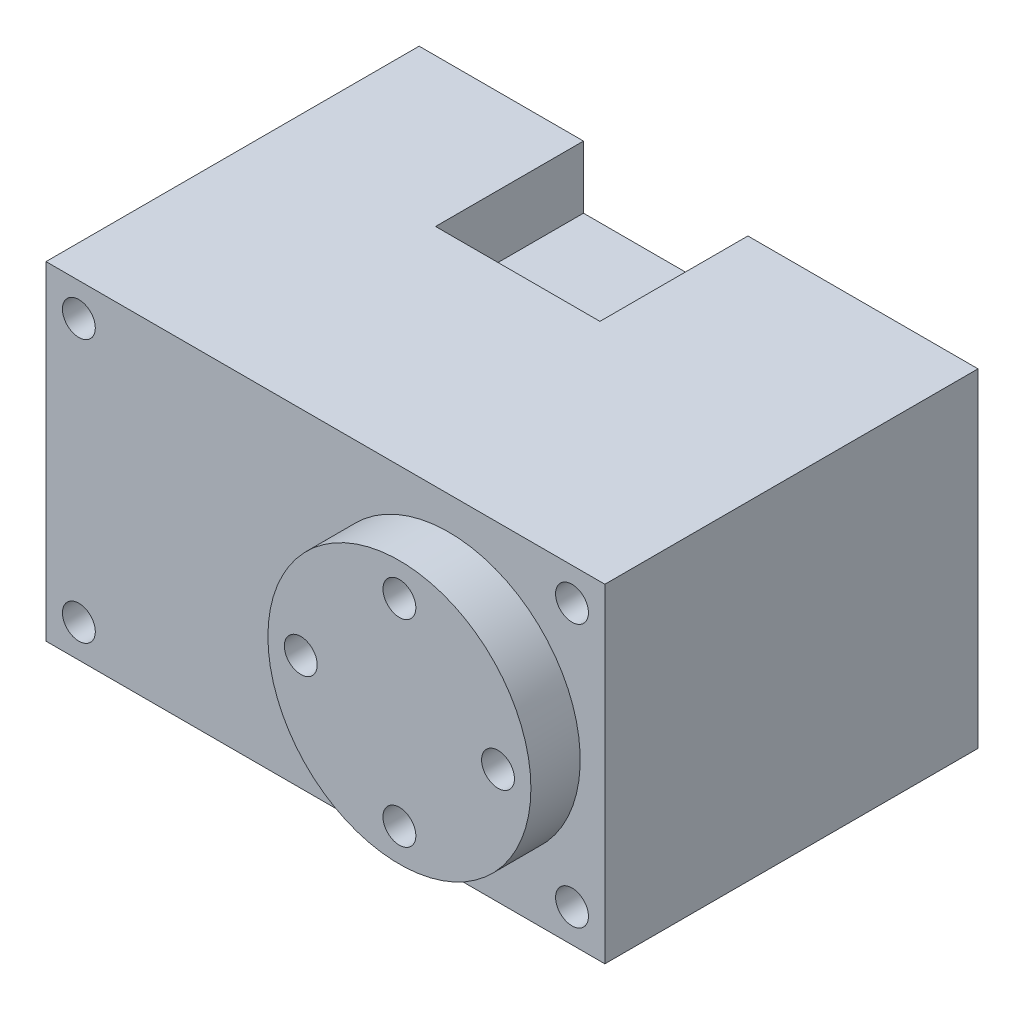
ISO-10303-21;
HEADER;
FILE_DESCRIPTION(('STEP AP214'),'2;1');
FILE_NAME('part.step','',(''),(''),'','','');
FILE_SCHEMA(('AUTOMOTIVE_DESIGN { 1 0 10303 214 1 1 1 1 }'));
ENDSEC;
DATA;
#1=APPLICATION_CONTEXT('core data for automotive mechanical design processes');
#2=APPLICATION_PROTOCOL_DEFINITION('international standard','automotive_design',2000,#1);
#3=PRODUCT_CONTEXT('',#1,'mechanical');
#4=PRODUCT('Part','Part','',(#3));
#5=PRODUCT_RELATED_PRODUCT_CATEGORY('part','',(#4));
#6=PRODUCT_DEFINITION_FORMATION('','',#4);
#7=PRODUCT_DEFINITION_CONTEXT('part definition',#1,'design');
#8=PRODUCT_DEFINITION('design','',#6,#7);
#9=PRODUCT_DEFINITION_SHAPE('','',#8);
#10=(LENGTH_UNIT() NAMED_UNIT(*) SI_UNIT(.MILLI.,.METRE.));
#11=(NAMED_UNIT(*) PLANE_ANGLE_UNIT() SI_UNIT($,.RADIAN.));
#12=(NAMED_UNIT(*) SI_UNIT($,.STERADIAN.) SOLID_ANGLE_UNIT());
#13=UNCERTAINTY_MEASURE_WITH_UNIT(LENGTH_MEASURE(1.E-05),#10,'distance_accuracy_value','');
#14=(GEOMETRIC_REPRESENTATION_CONTEXT(3) GLOBAL_UNCERTAINTY_ASSIGNED_CONTEXT((#13)) GLOBAL_UNIT_ASSIGNED_CONTEXT((#10,
#11,#12)) REPRESENTATION_CONTEXT('',''));
#15=CARTESIAN_POINT('',(0.,0.,0.));
#16=DIRECTION('',(0.,0.,1.));
#17=DIRECTION('',(1.,0.,0.));
#18=AXIS2_PLACEMENT_3D('',#15,#16,#17);
#19=CARTESIAN_POINT('',(-17.,-10.,22.7));
#20=DIRECTION('',(0.,1.,0.));
#21=DIRECTION('',(0.,0.,1.));
#22=AXIS2_PLACEMENT_3D('',#19,#20,#21);
#23=PLANE('',#22);
#24=DIRECTION('',(0.,0.,1.));
#25=VECTOR('',#24,1.);
#26=CARTESIAN_POINT('',(-7.,-10.,0.));
#27=LINE('',#26,#25);
#28=CARTESIAN_POINT('',(-7.,-10.,0.));
#29=VERTEX_POINT('',#28);
#30=CARTESIAN_POINT('',(-7.,-10.,9.));
#31=VERTEX_POINT('',#30);
#32=EDGE_CURVE('E304',#29,#31,#27,.T.);
#33=ORIENTED_EDGE('',*,*,#32,.T.);
#34=DIRECTION('',(1.,0.,0.));
#35=VECTOR('',#34,1.);
#36=CARTESIAN_POINT('',(-7.,-10.,9.));
#37=LINE('',#36,#35);
#38=CARTESIAN_POINT('',(3.00000000000001,-10.,9.));
#39=VERTEX_POINT('',#38);
#40=EDGE_CURVE('E303',#31,#39,#37,.T.);
#41=ORIENTED_EDGE('',*,*,#40,.T.);
#42=DIRECTION('',(0.,0.,-1.));
#43=VECTOR('',#42,1.);
#44=CARTESIAN_POINT('',(3.,-10.,0.));
#45=LINE('',#44,#43);
#46=CARTESIAN_POINT('',(3.,-10.,0.));
#47=VERTEX_POINT('',#46);
#48=EDGE_CURVE('E302',#39,#47,#45,.T.);
#49=ORIENTED_EDGE('',*,*,#48,.T.);
#50=DIRECTION('',(1.,0.,0.));
#51=VECTOR('',#50,1.);
#52=CARTESIAN_POINT('',(-17.,-10.,0.));
#53=LINE('',#52,#51);
#54=CARTESIAN_POINT('',(17.,-10.,0.));
#55=VERTEX_POINT('',#54);
#56=EDGE_CURVE('E144',#47,#55,#53,.T.);
#57=ORIENTED_EDGE('',*,*,#56,.T.);
#58=DIRECTION('',(0.,0.,-1.));
#59=VECTOR('',#58,1.);
#60=CARTESIAN_POINT('',(17.,-10.,22.7));
#61=LINE('',#60,#59);
#62=CARTESIAN_POINT('',(17.,-10.,22.7));
#63=VERTEX_POINT('',#62);
#64=EDGE_CURVE('E251',#63,#55,#61,.T.);
#65=ORIENTED_EDGE('',*,*,#64,.F.);
#66=DIRECTION('',(1.,0.,0.));
#67=VECTOR('',#66,1.);
#68=CARTESIAN_POINT('',(-17.,-10.,22.7));
#69=LINE('',#68,#67);
#70=CARTESIAN_POINT('',(-17.,-10.,22.7));
#71=VERTEX_POINT('',#70);
#72=EDGE_CURVE('E249',#71,#63,#69,.T.);
#73=ORIENTED_EDGE('',*,*,#72,.F.);
#74=DIRECTION('',(0.,0.,-1.));
#75=VECTOR('',#74,1.);
#76=CARTESIAN_POINT('',(-17.,-10.,22.7));
#77=LINE('',#76,#75);
#78=CARTESIAN_POINT('',(-17.,-10.,0.));
#79=VERTEX_POINT('',#78);
#80=EDGE_CURVE('E264',#71,#79,#77,.T.);
#81=ORIENTED_EDGE('',*,*,#80,.T.);
#82=EDGE_CURVE('E245',#79,#29,#53,.T.);
#83=ORIENTED_EDGE('',*,*,#82,.T.);
#84=EDGE_LOOP('',(#33,#41,#49,#57,#65,#73,#81,#83));
#85=FACE_BOUND('',#84,.T.);
#86=ADVANCED_FACE('F34',(#85),#23,.F.);
#87=CARTESIAN_POINT('',(0.,0.,0.));
#88=DIRECTION('',(0.,0.,-1.));
#89=DIRECTION('',(-1.,0.,0.));
#90=AXIS2_PLACEMENT_3D('',#87,#88,#89);
#91=PLANE('',#90);
#92=CARTESIAN_POINT('',(7.5,0.,0.));
#93=DIRECTION('',(0.,0.,-1.));
#94=DIRECTION('',(-1.,0.,0.));
#95=AXIS2_PLACEMENT_3D('',#92,#93,#94);
#96=CIRCLE('',#95,5.);
#97=CARTESIAN_POINT('',(2.5,0.,0.));
#98=VERTEX_POINT('',#97);
#99=EDGE_CURVE('E181',#98,#98,#96,.T.);
#100=ORIENTED_EDGE('',*,*,#99,.F.);
#101=EDGE_LOOP('',(#100));
#102=FACE_BOUND('',#101,.T.);
#103=CARTESIAN_POINT('',(-15.,8.,0.));
#104=DIRECTION('',(0.,0.,-1.));
#105=DIRECTION('',(-1.,0.,0.));
#106=AXIS2_PLACEMENT_3D('',#103,#104,#105);
#107=CIRCLE('',#106,1.);
#108=CARTESIAN_POINT('',(-16.,8.,0.));
#109=VERTEX_POINT('',#108);
#110=EDGE_CURVE('E200',#109,#109,#107,.T.);
#111=ORIENTED_EDGE('',*,*,#110,.F.);
#112=EDGE_LOOP('',(#111));
#113=FACE_BOUND('',#112,.T.);
#114=CARTESIAN_POINT('',(15.,-8.,0.));
#115=DIRECTION('',(0.,0.,-1.));
#116=DIRECTION('',(-1.,0.,0.));
#117=AXIS2_PLACEMENT_3D('',#114,#115,#116);
#118=CIRCLE('',#117,1.);
#119=CARTESIAN_POINT('',(14.,-8.,0.));
#120=VERTEX_POINT('',#119);
#121=EDGE_CURVE('E193',#120,#120,#118,.T.);
#122=ORIENTED_EDGE('',*,*,#121,.F.);
#123=EDGE_LOOP('',(#122));
#124=FACE_BOUND('',#123,.T.);
#125=CARTESIAN_POINT('',(-15.,-8.,0.));
#126=DIRECTION('',(0.,0.,-1.));
#127=DIRECTION('',(-1.,0.,0.));
#128=AXIS2_PLACEMENT_3D('',#125,#126,#127);
#129=CIRCLE('',#128,1.);
#130=CARTESIAN_POINT('',(-16.,-8.,0.));
#131=VERTEX_POINT('',#130);
#132=EDGE_CURVE('E187',#131,#131,#129,.T.);
#133=ORIENTED_EDGE('',*,*,#132,.F.);
#134=EDGE_LOOP('',(#133));
#135=FACE_BOUND('',#134,.T.);
#136=CARTESIAN_POINT('',(15.,7.99999999999999,0.));
#137=DIRECTION('',(0.,0.,-1.));
#138=DIRECTION('',(-1.,0.,0.));
#139=AXIS2_PLACEMENT_3D('',#136,#137,#138);
#140=CIRCLE('',#139,1.);
#141=CARTESIAN_POINT('',(14.,7.99999999999999,0.));
#142=VERTEX_POINT('',#141);
#143=EDGE_CURVE('E199',#142,#142,#140,.T.);
#144=ORIENTED_EDGE('',*,*,#143,.F.);
#145=EDGE_LOOP('',(#144));
#146=FACE_BOUND('',#145,.T.);
#147=DIRECTION('',(-1.,0.,0.));
#148=VECTOR('',#147,1.);
#149=CARTESIAN_POINT('',(-7.,-6.20000000000001,0.));
#150=LINE('',#149,#148);
#151=CARTESIAN_POINT('',(3.,-6.20000000000001,0.));
#152=VERTEX_POINT('',#151);
#153=CARTESIAN_POINT('',(-7.,-6.20000000000001,0.));
#154=VERTEX_POINT('',#153);
#155=EDGE_CURVE('E134',#152,#154,#150,.T.);
#156=ORIENTED_EDGE('',*,*,#155,.T.);
#157=DIRECTION('',(0.,-1.,0.));
#158=VECTOR('',#157,1.);
#159=CARTESIAN_POINT('',(-7.,-6.20000000000001,0.));
#160=LINE('',#159,#158);
#161=EDGE_CURVE('E145',#154,#29,#160,.T.);
#162=ORIENTED_EDGE('',*,*,#161,.T.);
#163=ORIENTED_EDGE('',*,*,#82,.F.);
#164=DIRECTION('',(0.,-1.,0.));
#165=VECTOR('',#164,1.);
#166=CARTESIAN_POINT('',(-17.,-10.,0.));
#167=LINE('',#166,#165);
#168=CARTESIAN_POINT('',(-17.,10.,0.));
#169=VERTEX_POINT('',#168);
#170=EDGE_CURVE('E258',#169,#79,#167,.T.);
#171=ORIENTED_EDGE('',*,*,#170,.F.);
#172=DIRECTION('',(-1.,0.,0.));
#173=VECTOR('',#172,1.);
#174=CARTESIAN_POINT('',(-17.,10.,0.));
#175=LINE('',#174,#173);
#176=CARTESIAN_POINT('',(-7.,10.,0.));
#177=VERTEX_POINT('',#176);
#178=EDGE_CURVE('E254',#177,#169,#175,.T.);
#179=ORIENTED_EDGE('',*,*,#178,.F.);
#180=DIRECTION('',(0.,1.,0.));
#181=VECTOR('',#180,1.);
#182=CARTESIAN_POINT('',(-7.,6.20000000000001,0.));
#183=LINE('',#182,#181);
#184=CARTESIAN_POINT('',(-7.,6.20000000000001,0.));
#185=VERTEX_POINT('',#184);
#186=EDGE_CURVE('E169',#185,#177,#183,.T.);
#187=ORIENTED_EDGE('',*,*,#186,.F.);
#188=DIRECTION('',(-1.,0.,0.));
#189=VECTOR('',#188,1.);
#190=CARTESIAN_POINT('',(-7.,6.20000000000001,0.));
#191=LINE('',#190,#189);
#192=CARTESIAN_POINT('',(3.00000000000001,6.20000000000001,0.));
#193=VERTEX_POINT('',#192);
#194=EDGE_CURVE('E159',#193,#185,#191,.T.);
#195=ORIENTED_EDGE('',*,*,#194,.F.);
#196=DIRECTION('',(0.,1.,0.));
#197=VECTOR('',#196,1.);
#198=CARTESIAN_POINT('',(3.,6.20000000000001,0.));
#199=LINE('',#198,#197);
#200=CARTESIAN_POINT('',(3.,10.,0.));
#201=VERTEX_POINT('',#200);
#202=EDGE_CURVE('E172',#193,#201,#199,.T.);
#203=ORIENTED_EDGE('',*,*,#202,.T.);
#204=CARTESIAN_POINT('',(17.,10.,0.));
#205=VERTEX_POINT('',#204);
#206=EDGE_CURVE('E255',#205,#201,#175,.T.);
#207=ORIENTED_EDGE('',*,*,#206,.F.);
#208=DIRECTION('',(0.,1.,0.));
#209=VECTOR('',#208,1.);
#210=CARTESIAN_POINT('',(17.,-10.,0.));
#211=LINE('',#210,#209);
#212=EDGE_CURVE('E240',#55,#205,#211,.T.);
#213=ORIENTED_EDGE('',*,*,#212,.F.);
#214=ORIENTED_EDGE('',*,*,#56,.F.);
#215=DIRECTION('',(0.,-1.,0.));
#216=VECTOR('',#215,1.);
#217=CARTESIAN_POINT('',(3.,-6.20000000000001,0.));
#218=LINE('',#217,#216);
#219=EDGE_CURVE('E130',#152,#47,#218,.T.);
#220=ORIENTED_EDGE('',*,*,#219,.F.);
#221=EDGE_LOOP('',(#156,#162,#163,#171,#179,#187,#195,#203,#207,#213,#214,#220));
#222=FACE_BOUND('',#221,.T.);
#223=ADVANCED_FACE('F142',(#102,#113,#124,#135,#146,#222),#91,.T.);
#224=CARTESIAN_POINT('',(17.,-10.,22.7));
#225=DIRECTION('',(-1.,0.,0.));
#226=DIRECTION('',(0.,0.,1.));
#227=AXIS2_PLACEMENT_3D('',#224,#225,#226);
#228=PLANE('',#227);
#229=ORIENTED_EDGE('',*,*,#212,.T.);
#230=DIRECTION('',(0.,0.,-1.));
#231=VECTOR('',#230,1.);
#232=CARTESIAN_POINT('',(17.,10.,22.7));
#233=LINE('',#232,#231);
#234=CARTESIAN_POINT('',(17.,10.,22.7));
#235=VERTEX_POINT('',#234);
#236=EDGE_CURVE('E42',#235,#205,#233,.T.);
#237=ORIENTED_EDGE('',*,*,#236,.F.);
#238=DIRECTION('',(0.,1.,0.));
#239=VECTOR('',#238,1.);
#240=CARTESIAN_POINT('',(17.,-10.,22.7));
#241=LINE('',#240,#239);
#242=EDGE_CURVE('E241',#63,#235,#241,.T.);
#243=ORIENTED_EDGE('',*,*,#242,.F.);
#244=ORIENTED_EDGE('',*,*,#64,.T.);
#245=EDGE_LOOP('',(#229,#237,#243,#244));
#246=FACE_BOUND('',#245,.T.);
#247=ADVANCED_FACE('F36',(#246),#228,.F.);
#248=CARTESIAN_POINT('',(-17.,10.,22.7));
#249=DIRECTION('',(0.,-1.,0.));
#250=DIRECTION('',(0.,0.,-1.));
#251=AXIS2_PLACEMENT_3D('',#248,#249,#250);
#252=PLANE('',#251);
#253=DIRECTION('',(1.,0.,0.));
#254=VECTOR('',#253,1.);
#255=CARTESIAN_POINT('',(-7.,10.,9.));
#256=LINE('',#255,#254);
#257=CARTESIAN_POINT('',(-7.,10.,9.));
#258=VERTEX_POINT('',#257);
#259=CARTESIAN_POINT('',(3.00000000000001,10.,9.));
#260=VERTEX_POINT('',#259);
#261=EDGE_CURVE('E165',#258,#260,#256,.T.);
#262=ORIENTED_EDGE('',*,*,#261,.F.);
#263=DIRECTION('',(0.,0.,1.));
#264=VECTOR('',#263,1.);
#265=CARTESIAN_POINT('',(-7.,10.,0.));
#266=LINE('',#265,#264);
#267=EDGE_CURVE('E162',#177,#258,#266,.T.);
#268=ORIENTED_EDGE('',*,*,#267,.F.);
#269=ORIENTED_EDGE('',*,*,#178,.T.);
#270=DIRECTION('',(0.,0.,-1.));
#271=VECTOR('',#270,1.);
#272=CARTESIAN_POINT('',(-17.,10.,22.7));
#273=LINE('',#272,#271);
#274=CARTESIAN_POINT('',(-17.,10.,22.7));
#275=VERTEX_POINT('',#274);
#276=EDGE_CURVE('E267',#275,#169,#273,.T.);
#277=ORIENTED_EDGE('',*,*,#276,.F.);
#278=DIRECTION('',(-1.,0.,0.));
#279=VECTOR('',#278,1.);
#280=CARTESIAN_POINT('',(-17.,10.,22.7));
#281=LINE('',#280,#279);
#282=EDGE_CURVE('E244',#235,#275,#281,.T.);
#283=ORIENTED_EDGE('',*,*,#282,.F.);
#284=ORIENTED_EDGE('',*,*,#236,.T.);
#285=ORIENTED_EDGE('',*,*,#206,.T.);
#286=DIRECTION('',(0.,0.,-1.));
#287=VECTOR('',#286,1.);
#288=CARTESIAN_POINT('',(3.,10.,0.));
#289=LINE('',#288,#287);
#290=EDGE_CURVE('E156',#260,#201,#289,.T.);
#291=ORIENTED_EDGE('',*,*,#290,.F.);
#292=EDGE_LOOP('',(#262,#268,#269,#277,#283,#284,#285,#291));
#293=FACE_BOUND('',#292,.T.);
#294=ADVANCED_FACE('F273',(#293),#252,.F.);
#295=CARTESIAN_POINT('',(-17.,-10.,22.7));
#296=DIRECTION('',(1.,0.,0.));
#297=DIRECTION('',(0.,0.,-1.));
#298=AXIS2_PLACEMENT_3D('',#295,#296,#297);
#299=PLANE('',#298);
#300=ORIENTED_EDGE('',*,*,#170,.T.);
#301=ORIENTED_EDGE('',*,*,#80,.F.);
#302=DIRECTION('',(0.,-1.,0.));
#303=VECTOR('',#302,1.);
#304=CARTESIAN_POINT('',(-17.,-10.,22.7));
#305=LINE('',#304,#303);
#306=EDGE_CURVE('E247',#275,#71,#305,.T.);
#307=ORIENTED_EDGE('',*,*,#306,.F.);
#308=ORIENTED_EDGE('',*,*,#276,.T.);
#309=EDGE_LOOP('',(#300,#301,#307,#308));
#310=FACE_BOUND('',#309,.T.);
#311=ADVANCED_FACE('F294',(#310),#299,.F.);
#312=CARTESIAN_POINT('',(0.,0.,22.7));
#313=DIRECTION('',(0.,0.,-1.));
#314=DIRECTION('',(-1.,0.,0.));
#315=AXIS2_PLACEMENT_3D('',#312,#313,#314);
#316=PLANE('',#315);
#317=CARTESIAN_POINT('',(15.,8.,22.7));
#318=DIRECTION('',(0.,0.,1.));
#319=DIRECTION('',(1.,0.,0.));
#320=AXIS2_PLACEMENT_3D('',#317,#318,#319);
#321=CIRCLE('',#320,1.);
#322=CARTESIAN_POINT('',(16.,8.,22.7));
#323=VERTEX_POINT('',#322);
#324=EDGE_CURVE('E224',#323,#323,#321,.T.);
#325=ORIENTED_EDGE('',*,*,#324,.F.);
#326=EDGE_LOOP('',(#325));
#327=FACE_BOUND('',#326,.T.);
#328=CARTESIAN_POINT('',(-15.,-8.,22.7));
#329=DIRECTION('',(0.,0.,1.));
#330=DIRECTION('',(1.,0.,0.));
#331=AXIS2_PLACEMENT_3D('',#328,#329,#330);
#332=CIRCLE('',#331,1.);
#333=CARTESIAN_POINT('',(-14.,-8.,22.7));
#334=VERTEX_POINT('',#333);
#335=EDGE_CURVE('E217',#334,#334,#332,.T.);
#336=ORIENTED_EDGE('',*,*,#335,.F.);
#337=EDGE_LOOP('',(#336));
#338=FACE_BOUND('',#337,.T.);
#339=CARTESIAN_POINT('',(15.,-8.,22.7));
#340=DIRECTION('',(0.,0.,1.));
#341=DIRECTION('',(1.,0.,0.));
#342=AXIS2_PLACEMENT_3D('',#339,#340,#341);
#343=CIRCLE('',#342,1.);
#344=CARTESIAN_POINT('',(16.,-8.,22.7));
#345=VERTEX_POINT('',#344);
#346=EDGE_CURVE('E211',#345,#345,#343,.T.);
#347=ORIENTED_EDGE('',*,*,#346,.F.);
#348=EDGE_LOOP('',(#347));
#349=FACE_BOUND('',#348,.T.);
#350=CARTESIAN_POINT('',(-15.,8.,22.7));
#351=DIRECTION('',(0.,0.,1.));
#352=DIRECTION('',(1.,0.,0.));
#353=AXIS2_PLACEMENT_3D('',#350,#351,#352);
#354=CIRCLE('',#353,1.);
#355=CARTESIAN_POINT('',(-14.,8.,22.7));
#356=VERTEX_POINT('',#355);
#357=EDGE_CURVE('E223',#356,#356,#354,.T.);
#358=ORIENTED_EDGE('',*,*,#357,.F.);
#359=EDGE_LOOP('',(#358));
#360=FACE_BOUND('',#359,.T.);
#361=CARTESIAN_POINT('',(7.5,0.,22.7));
#362=DIRECTION('',(0.,0.,-1.));
#363=DIRECTION('',(-1.,0.,0.));
#364=AXIS2_PLACEMENT_3D('',#361,#362,#363);
#365=CIRCLE('',#364,8.);
#366=CARTESIAN_POINT('',(-0.500000000000002,0.,22.7));
#367=VERTEX_POINT('',#366);
#368=EDGE_CURVE('E11',#367,#367,#365,.F.);
#369=ORIENTED_EDGE('',*,*,#368,.F.);
#370=EDGE_LOOP('',(#369));
#371=FACE_BOUND('',#370,.T.);
#372=ORIENTED_EDGE('',*,*,#242,.T.);
#373=ORIENTED_EDGE('',*,*,#282,.T.);
#374=ORIENTED_EDGE('',*,*,#306,.T.);
#375=ORIENTED_EDGE('',*,*,#72,.T.);
#376=EDGE_LOOP('',(#372,#373,#374,#375));
#377=FACE_BOUND('',#376,.T.);
#378=ADVANCED_FACE('F298',(#327,#338,#349,#360,#371,#377),#316,.F.);
#379=CARTESIAN_POINT('',(7.5,0.,25.7));
#380=DIRECTION('',(0.,0.,-1.));
#381=DIRECTION('',(-1.,0.,0.));
#382=AXIS2_PLACEMENT_3D('',#379,#380,#381);
#383=CYLINDRICAL_SURFACE('',#382,8.);
#384=CARTESIAN_POINT('',(7.5,0.,25.7));
#385=DIRECTION('',(0.,0.,1.));
#386=DIRECTION('',(1.,0.,0.));
#387=AXIS2_PLACEMENT_3D('',#384,#385,#386);
#388=CIRCLE('',#387,8.);
#389=CARTESIAN_POINT('',(15.5,0.,25.7));
#390=VERTEX_POINT('',#389);
#391=EDGE_CURVE('E235',#390,#390,#388,.T.);
#392=ORIENTED_EDGE('',*,*,#391,.F.);
#393=EDGE_LOOP('',(#392));
#394=FACE_BOUND('',#393,.T.);
#395=ORIENTED_EDGE('',*,*,#368,.T.);
#396=EDGE_LOOP('',(#395));
#397=FACE_BOUND('',#396,.T.);
#398=ADVANCED_FACE('F361',(#394,#397),#383,.T.);
#399=CARTESIAN_POINT('',(7.5,0.,25.7));
#400=DIRECTION('',(0.,0.,1.));
#401=DIRECTION('',(1.,0.,0.));
#402=AXIS2_PLACEMENT_3D('',#399,#400,#401);
#403=PLANE('',#402);
#404=CARTESIAN_POINT('',(7.49999999999998,6.,25.7));
#405=DIRECTION('',(0.,0.,1.));
#406=DIRECTION('',(0.,1.,0.));
#407=AXIS2_PLACEMENT_3D('',#404,#405,#406);
#408=CIRCLE('',#407,1.);
#409=CARTESIAN_POINT('',(7.49999999999998,7.,25.7));
#410=VERTEX_POINT('',#409);
#411=EDGE_CURVE('E342',#410,#410,#408,.T.);
#412=ORIENTED_EDGE('',*,*,#411,.F.);
#413=EDGE_LOOP('',(#412));
#414=FACE_BOUND('',#413,.T.);
#415=CARTESIAN_POINT('',(1.5,0.,25.7));
#416=DIRECTION('',(0.,0.,1.));
#417=DIRECTION('',(-1.,0.,0.));
#418=AXIS2_PLACEMENT_3D('',#415,#416,#417);
#419=CIRCLE('',#418,1.);
#420=CARTESIAN_POINT('',(0.5,0.,25.7));
#421=VERTEX_POINT('',#420);
#422=EDGE_CURVE('E336',#421,#421,#419,.T.);
#423=ORIENTED_EDGE('',*,*,#422,.F.);
#424=EDGE_LOOP('',(#423));
#425=FACE_BOUND('',#424,.T.);
#426=CARTESIAN_POINT('',(7.50000000000006,-6.,25.7));
#427=DIRECTION('',(0.,0.,1.));
#428=DIRECTION('',(0.,-1.,0.));
#429=AXIS2_PLACEMENT_3D('',#426,#427,#428);
#430=CIRCLE('',#429,1.);
#431=CARTESIAN_POINT('',(7.50000000000007,-7.,25.7));
#432=VERTEX_POINT('',#431);
#433=EDGE_CURVE('E330',#432,#432,#430,.T.);
#434=ORIENTED_EDGE('',*,*,#433,.F.);
#435=EDGE_LOOP('',(#434));
#436=FACE_BOUND('',#435,.T.);
#437=CARTESIAN_POINT('',(13.5,0.,25.7));
#438=DIRECTION('',(0.,0.,1.));
#439=DIRECTION('',(1.,0.,0.));
#440=AXIS2_PLACEMENT_3D('',#437,#438,#439);
#441=CIRCLE('',#440,1.);
#442=CARTESIAN_POINT('',(14.5,0.,25.7));
#443=VERTEX_POINT('',#442);
#444=EDGE_CURVE('E324',#443,#443,#441,.T.);
#445=ORIENTED_EDGE('',*,*,#444,.F.);
#446=EDGE_LOOP('',(#445));
#447=FACE_BOUND('',#446,.T.);
#448=ORIENTED_EDGE('',*,*,#391,.T.);
#449=EDGE_LOOP('',(#448));
#450=FACE_BOUND('',#449,.T.);
#451=ADVANCED_FACE('F357',(#414,#425,#436,#447,#450),#403,.T.);
#452=CARTESIAN_POINT('',(-15.,8.,16.7));
#453=DIRECTION('',(0.,0.,1.));
#454=DIRECTION('',(1.,0.,0.));
#455=AXIS2_PLACEMENT_3D('',#452,#453,#454);
#456=CYLINDRICAL_SURFACE('',#455,1.);
#457=CARTESIAN_POINT('',(-15.,8.,16.7));
#458=DIRECTION('',(0.,0.,1.));
#459=DIRECTION('',(1.,0.,0.));
#460=AXIS2_PLACEMENT_3D('',#457,#458,#459);
#461=CIRCLE('',#460,1.);
#462=CARTESIAN_POINT('',(-14.,8.,16.7));
#463=VERTEX_POINT('',#462);
#464=EDGE_CURVE('E232',#463,#463,#461,.T.);
#465=ORIENTED_EDGE('',*,*,#464,.F.);
#466=EDGE_LOOP('',(#465));
#467=FACE_BOUND('',#466,.T.);
#468=ORIENTED_EDGE('',*,*,#357,.T.);
#469=EDGE_LOOP('',(#468));
#470=FACE_BOUND('',#469,.T.);
#471=ADVANCED_FACE('F360',(#467,#470),#456,.F.);
#472=CARTESIAN_POINT('',(-15.,8.,16.7));
#473=DIRECTION('',(0.,0.,1.));
#474=DIRECTION('',(1.,0.,0.));
#475=AXIS2_PLACEMENT_3D('',#472,#473,#474);
#476=PLANE('',#475);
#477=ORIENTED_EDGE('',*,*,#464,.T.);
#478=EDGE_LOOP('',(#477));
#479=FACE_BOUND('',#478,.T.);
#480=ADVANCED_FACE('F620',(#479),#476,.T.);
#481=CARTESIAN_POINT('',(15.,-8.,16.7));
#482=DIRECTION('',(0.,0.,1.));
#483=DIRECTION('',(1.,0.,0.));
#484=AXIS2_PLACEMENT_3D('',#481,#482,#483);
#485=CYLINDRICAL_SURFACE('',#484,1.);
#486=CARTESIAN_POINT('',(15.,-8.,16.7));
#487=DIRECTION('',(0.,0.,1.));
#488=DIRECTION('',(1.,0.,0.));
#489=AXIS2_PLACEMENT_3D('',#486,#487,#488);
#490=CIRCLE('',#489,1.);
#491=CARTESIAN_POINT('',(16.,-8.,16.7));
#492=VERTEX_POINT('',#491);
#493=EDGE_CURVE('E214',#492,#492,#490,.T.);
#494=ORIENTED_EDGE('',*,*,#493,.F.);
#495=EDGE_LOOP('',(#494));
#496=FACE_BOUND('',#495,.T.);
#497=ORIENTED_EDGE('',*,*,#346,.T.);
#498=EDGE_LOOP('',(#497));
#499=FACE_BOUND('',#498,.T.);
#500=ADVANCED_FACE('F616',(#496,#499),#485,.F.);
#501=CARTESIAN_POINT('',(15.,-8.,16.7));
#502=DIRECTION('',(0.,0.,1.));
#503=DIRECTION('',(1.,0.,0.));
#504=AXIS2_PLACEMENT_3D('',#501,#502,#503);
#505=PLANE('',#504);
#506=ORIENTED_EDGE('',*,*,#493,.T.);
#507=EDGE_LOOP('',(#506));
#508=FACE_BOUND('',#507,.T.);
#509=ADVANCED_FACE('F612',(#508),#505,.T.);
#510=CARTESIAN_POINT('',(-15.,-8.,16.7));
#511=DIRECTION('',(0.,0.,1.));
#512=DIRECTION('',(1.,0.,0.));
#513=AXIS2_PLACEMENT_3D('',#510,#511,#512);
#514=CYLINDRICAL_SURFACE('',#513,1.);
#515=CARTESIAN_POINT('',(-15.,-8.,16.7));
#516=DIRECTION('',(0.,0.,1.));
#517=DIRECTION('',(1.,0.,0.));
#518=AXIS2_PLACEMENT_3D('',#515,#516,#517);
#519=CIRCLE('',#518,1.);
#520=CARTESIAN_POINT('',(-14.,-8.,16.7));
#521=VERTEX_POINT('',#520);
#522=EDGE_CURVE('E227',#521,#521,#519,.T.);
#523=ORIENTED_EDGE('',*,*,#522,.F.);
#524=EDGE_LOOP('',(#523));
#525=FACE_BOUND('',#524,.T.);
#526=ORIENTED_EDGE('',*,*,#335,.T.);
#527=EDGE_LOOP('',(#526));
#528=FACE_BOUND('',#527,.T.);
#529=ADVANCED_FACE('F615',(#525,#528),#514,.F.);
#530=CARTESIAN_POINT('',(-15.,-8.,16.7));
#531=DIRECTION('',(0.,0.,1.));
#532=DIRECTION('',(1.,0.,0.));
#533=AXIS2_PLACEMENT_3D('',#530,#531,#532);
#534=PLANE('',#533);
#535=ORIENTED_EDGE('',*,*,#522,.T.);
#536=EDGE_LOOP('',(#535));
#537=FACE_BOUND('',#536,.T.);
#538=ADVANCED_FACE('F628',(#537),#534,.T.);
#539=CARTESIAN_POINT('',(15.,8.,16.7));
#540=DIRECTION('',(0.,0.,1.));
#541=DIRECTION('',(1.,0.,0.));
#542=AXIS2_PLACEMENT_3D('',#539,#540,#541);
#543=CYLINDRICAL_SURFACE('',#542,1.);
#544=CARTESIAN_POINT('',(15.,8.,16.7));
#545=DIRECTION('',(0.,0.,1.));
#546=DIRECTION('',(1.,0.,0.));
#547=AXIS2_PLACEMENT_3D('',#544,#545,#546);
#548=CIRCLE('',#547,1.);
#549=CARTESIAN_POINT('',(16.,8.,16.7));
#550=VERTEX_POINT('',#549);
#551=EDGE_CURVE('E220',#550,#550,#548,.T.);
#552=ORIENTED_EDGE('',*,*,#551,.F.);
#553=EDGE_LOOP('',(#552));
#554=FACE_BOUND('',#553,.T.);
#555=ORIENTED_EDGE('',*,*,#324,.T.);
#556=EDGE_LOOP('',(#555));
#557=FACE_BOUND('',#556,.T.);
#558=ADVANCED_FACE('F624',(#554,#557),#543,.F.);
#559=CARTESIAN_POINT('',(15.,8.,16.7));
#560=DIRECTION('',(0.,0.,1.));
#561=DIRECTION('',(1.,0.,0.));
#562=AXIS2_PLACEMENT_3D('',#559,#560,#561);
#563=PLANE('',#562);
#564=ORIENTED_EDGE('',*,*,#551,.T.);
#565=EDGE_LOOP('',(#564));
#566=FACE_BOUND('',#565,.T.);
#567=ADVANCED_FACE('F610',(#566),#563,.T.);
#568=CARTESIAN_POINT('',(15.,7.99999999999999,6.));
#569=DIRECTION('',(0.,0.,-1.));
#570=DIRECTION('',(-1.,0.,0.));
#571=AXIS2_PLACEMENT_3D('',#568,#569,#570);
#572=CYLINDRICAL_SURFACE('',#571,1.);
#573=CARTESIAN_POINT('',(15.,7.99999999999999,6.));
#574=DIRECTION('',(0.,0.,-1.));
#575=DIRECTION('',(-1.,0.,0.));
#576=AXIS2_PLACEMENT_3D('',#573,#574,#575);
#577=CIRCLE('',#576,1.);
#578=CARTESIAN_POINT('',(14.,7.99999999999999,6.));
#579=VERTEX_POINT('',#578);
#580=EDGE_CURVE('E208',#579,#579,#577,.T.);
#581=ORIENTED_EDGE('',*,*,#580,.F.);
#582=EDGE_LOOP('',(#581));
#583=FACE_BOUND('',#582,.T.);
#584=ORIENTED_EDGE('',*,*,#143,.T.);
#585=EDGE_LOOP('',(#584));
#586=FACE_BOUND('',#585,.T.);
#587=ADVANCED_FACE('F606',(#583,#586),#572,.F.);
#588=CARTESIAN_POINT('',(15.,7.99999999999999,6.));
#589=DIRECTION('',(0.,0.,-1.));
#590=DIRECTION('',(-1.,0.,0.));
#591=AXIS2_PLACEMENT_3D('',#588,#589,#590);
#592=PLANE('',#591);
#593=ORIENTED_EDGE('',*,*,#580,.T.);
#594=EDGE_LOOP('',(#593));
#595=FACE_BOUND('',#594,.T.);
#596=ADVANCED_FACE('F588',(#595),#592,.T.);
#597=CARTESIAN_POINT('',(-15.,-8.,6.));
#598=DIRECTION('',(0.,0.,-1.));
#599=DIRECTION('',(-1.,0.,0.));
#600=AXIS2_PLACEMENT_3D('',#597,#598,#599);
#601=CYLINDRICAL_SURFACE('',#600,1.);
#602=CARTESIAN_POINT('',(-15.,-8.,6.));
#603=DIRECTION('',(0.,0.,-1.));
#604=DIRECTION('',(-1.,0.,0.));
#605=AXIS2_PLACEMENT_3D('',#602,#603,#604);
#606=CIRCLE('',#605,1.);
#607=CARTESIAN_POINT('',(-16.,-8.,6.));
#608=VERTEX_POINT('',#607);
#609=EDGE_CURVE('E190',#608,#608,#606,.T.);
#610=ORIENTED_EDGE('',*,*,#609,.F.);
#611=EDGE_LOOP('',(#610));
#612=FACE_BOUND('',#611,.T.);
#613=ORIENTED_EDGE('',*,*,#132,.T.);
#614=EDGE_LOOP('',(#613));
#615=FACE_BOUND('',#614,.T.);
#616=ADVANCED_FACE('F584',(#612,#615),#601,.F.);
#617=CARTESIAN_POINT('',(-15.,-8.,6.));
#618=DIRECTION('',(0.,0.,-1.));
#619=DIRECTION('',(-1.,0.,0.));
#620=AXIS2_PLACEMENT_3D('',#617,#618,#619);
#621=PLANE('',#620);
#622=ORIENTED_EDGE('',*,*,#609,.T.);
#623=EDGE_LOOP('',(#622));
#624=FACE_BOUND('',#623,.T.);
#625=ADVANCED_FACE('F580',(#624),#621,.T.);
#626=CARTESIAN_POINT('',(15.,-8.,6.));
#627=DIRECTION('',(0.,0.,-1.));
#628=DIRECTION('',(-1.,0.,0.));
#629=AXIS2_PLACEMENT_3D('',#626,#627,#628);
#630=CYLINDRICAL_SURFACE('',#629,1.);
#631=CARTESIAN_POINT('',(15.,-8.,6.));
#632=DIRECTION('',(0.,0.,-1.));
#633=DIRECTION('',(-1.,0.,0.));
#634=AXIS2_PLACEMENT_3D('',#631,#632,#633);
#635=CIRCLE('',#634,1.);
#636=CARTESIAN_POINT('',(14.,-8.,6.));
#637=VERTEX_POINT('',#636);
#638=EDGE_CURVE('E203',#637,#637,#635,.T.);
#639=ORIENTED_EDGE('',*,*,#638,.F.);
#640=EDGE_LOOP('',(#639));
#641=FACE_BOUND('',#640,.T.);
#642=ORIENTED_EDGE('',*,*,#121,.T.);
#643=EDGE_LOOP('',(#642));
#644=FACE_BOUND('',#643,.T.);
#645=ADVANCED_FACE('F583',(#641,#644),#630,.F.);
#646=CARTESIAN_POINT('',(15.,-8.,6.));
#647=DIRECTION('',(0.,0.,-1.));
#648=DIRECTION('',(-1.,0.,0.));
#649=AXIS2_PLACEMENT_3D('',#646,#647,#648);
#650=PLANE('',#649);
#651=ORIENTED_EDGE('',*,*,#638,.T.);
#652=EDGE_LOOP('',(#651));
#653=FACE_BOUND('',#652,.T.);
#654=ADVANCED_FACE('F596',(#653),#650,.T.);
#655=CARTESIAN_POINT('',(-15.,8.,6.));
#656=DIRECTION('',(0.,0.,-1.));
#657=DIRECTION('',(-1.,0.,0.));
#658=AXIS2_PLACEMENT_3D('',#655,#656,#657);
#659=CYLINDRICAL_SURFACE('',#658,1.);
#660=CARTESIAN_POINT('',(-15.,8.,6.));
#661=DIRECTION('',(0.,0.,-1.));
#662=DIRECTION('',(-1.,0.,0.));
#663=AXIS2_PLACEMENT_3D('',#660,#661,#662);
#664=CIRCLE('',#663,1.);
#665=CARTESIAN_POINT('',(-16.,8.,6.));
#666=VERTEX_POINT('',#665);
#667=EDGE_CURVE('E196',#666,#666,#664,.T.);
#668=ORIENTED_EDGE('',*,*,#667,.F.);
#669=EDGE_LOOP('',(#668));
#670=FACE_BOUND('',#669,.T.);
#671=ORIENTED_EDGE('',*,*,#110,.T.);
#672=EDGE_LOOP('',(#671));
#673=FACE_BOUND('',#672,.T.);
#674=ADVANCED_FACE('F592',(#670,#673),#659,.F.);
#675=CARTESIAN_POINT('',(-15.,8.,6.));
#676=DIRECTION('',(0.,0.,-1.));
#677=DIRECTION('',(-1.,0.,0.));
#678=AXIS2_PLACEMENT_3D('',#675,#676,#677);
#679=PLANE('',#678);
#680=ORIENTED_EDGE('',*,*,#667,.T.);
#681=EDGE_LOOP('',(#680));
#682=FACE_BOUND('',#681,.T.);
#683=ADVANCED_FACE('F578',(#682),#679,.T.);
#684=CARTESIAN_POINT('',(7.5,0.,1.));
#685=DIRECTION('',(0.,0.,-1.));
#686=DIRECTION('',(-1.,0.,0.));
#687=AXIS2_PLACEMENT_3D('',#684,#685,#686);
#688=CYLINDRICAL_SURFACE('',#687,5.);
#689=CARTESIAN_POINT('',(7.5,0.,1.));
#690=DIRECTION('',(0.,0.,-1.));
#691=DIRECTION('',(-1.,0.,0.));
#692=AXIS2_PLACEMENT_3D('',#689,#690,#691);
#693=CIRCLE('',#692,5.);
#694=CARTESIAN_POINT('',(2.5,0.,1.));
#695=VERTEX_POINT('',#694);
#696=EDGE_CURVE('E184',#695,#695,#693,.T.);
#697=ORIENTED_EDGE('',*,*,#696,.F.);
#698=EDGE_LOOP('',(#697));
#699=FACE_BOUND('',#698,.T.);
#700=ORIENTED_EDGE('',*,*,#99,.T.);
#701=EDGE_LOOP('',(#700));
#702=FACE_BOUND('',#701,.T.);
#703=ADVANCED_FACE('F574',(#699,#702),#688,.F.);
#704=CARTESIAN_POINT('',(7.5,0.,1.));
#705=DIRECTION('',(0.,0.,-1.));
#706=DIRECTION('',(-1.,0.,0.));
#707=AXIS2_PLACEMENT_3D('',#704,#705,#706);
#708=PLANE('',#707);
#709=CARTESIAN_POINT('',(7.5,0.,1.));
#710=DIRECTION('',(0.,0.,-1.));
#711=DIRECTION('',(-1.,0.,0.));
#712=AXIS2_PLACEMENT_3D('',#709,#710,#711);
#713=CIRCLE('',#712,2.5);
#714=CARTESIAN_POINT('',(5.,0.,1.));
#715=VERTEX_POINT('',#714);
#716=EDGE_CURVE('E171',#715,#715,#713,.T.);
#717=ORIENTED_EDGE('',*,*,#716,.F.);
#718=EDGE_LOOP('',(#717));
#719=FACE_BOUND('',#718,.T.);
#720=ORIENTED_EDGE('',*,*,#696,.T.);
#721=EDGE_LOOP('',(#720));
#722=FACE_BOUND('',#721,.T.);
#723=ADVANCED_FACE('F570',(#719,#722),#708,.T.);
#724=CARTESIAN_POINT('',(7.5,0.,3.));
#725=DIRECTION('',(0.,0.,-1.));
#726=DIRECTION('',(-1.,0.,0.));
#727=AXIS2_PLACEMENT_3D('',#724,#725,#726);
#728=CYLINDRICAL_SURFACE('',#727,2.5);
#729=CARTESIAN_POINT('',(7.5,0.,3.));
#730=DIRECTION('',(0.,0.,-1.));
#731=DIRECTION('',(-1.,0.,0.));
#732=AXIS2_PLACEMENT_3D('',#729,#730,#731);
#733=CIRCLE('',#732,2.5);
#734=CARTESIAN_POINT('',(5.,0.,3.));
#735=VERTEX_POINT('',#734);
#736=EDGE_CURVE('E178',#735,#735,#733,.T.);
#737=ORIENTED_EDGE('',*,*,#736,.F.);
#738=EDGE_LOOP('',(#737));
#739=FACE_BOUND('',#738,.T.);
#740=ORIENTED_EDGE('',*,*,#716,.T.);
#741=EDGE_LOOP('',(#740));
#742=FACE_BOUND('',#741,.T.);
#743=ADVANCED_FACE('F454',(#739,#742),#728,.F.);
#744=CARTESIAN_POINT('',(7.5,0.,3.));
#745=DIRECTION('',(0.,0.,-1.));
#746=DIRECTION('',(-1.,0.,0.));
#747=AXIS2_PLACEMENT_3D('',#744,#745,#746);
#748=PLANE('',#747);
#749=CARTESIAN_POINT('',(7.5,0.,3.));
#750=DIRECTION('',(0.,0.,-1.));
#751=DIRECTION('',(-1.,0.,0.));
#752=AXIS2_PLACEMENT_3D('',#749,#750,#751);
#753=CIRCLE('',#752,1.25);
#754=CARTESIAN_POINT('',(6.25,0.,3.));
#755=VERTEX_POINT('',#754);
#756=EDGE_CURVE('E318',#755,#755,#753,.T.);
#757=ORIENTED_EDGE('',*,*,#756,.F.);
#758=EDGE_LOOP('',(#757));
#759=FACE_BOUND('',#758,.T.);
#760=ORIENTED_EDGE('',*,*,#736,.T.);
#761=EDGE_LOOP('',(#760));
#762=FACE_BOUND('',#761,.T.);
#763=ADVANCED_FACE('F449',(#759,#762),#748,.T.);
#764=CARTESIAN_POINT('',(-7.,6.20000000000001,0.));
#765=DIRECTION('',(-1.,0.,0.));
#766=DIRECTION('',(0.,0.,1.));
#767=AXIS2_PLACEMENT_3D('',#764,#765,#766);
#768=PLANE('',#767);
#769=ORIENTED_EDGE('',*,*,#267,.T.);
#770=DIRECTION('',(0.,1.,0.));
#771=VECTOR('',#770,1.);
#772=CARTESIAN_POINT('',(-7.,6.20000000000001,9.));
#773=LINE('',#772,#771);
#774=CARTESIAN_POINT('',(-7.,6.20000000000001,9.));
#775=VERTEX_POINT('',#774);
#776=EDGE_CURVE('E161',#775,#258,#773,.T.);
#777=ORIENTED_EDGE('',*,*,#776,.F.);
#778=DIRECTION('',(0.,0.,1.));
#779=VECTOR('',#778,1.);
#780=CARTESIAN_POINT('',(-7.,6.20000000000001,0.));
#781=LINE('',#780,#779);
#782=EDGE_CURVE('E152',#185,#775,#781,.T.);
#783=ORIENTED_EDGE('',*,*,#782,.F.);
#784=ORIENTED_EDGE('',*,*,#186,.T.);
#785=EDGE_LOOP('',(#769,#777,#783,#784));
#786=FACE_BOUND('',#785,.T.);
#787=ADVANCED_FACE('F289',(#786),#768,.F.);
#788=CARTESIAN_POINT('',(3.,6.20000000000001,0.));
#789=DIRECTION('',(1.,0.,0.));
#790=DIRECTION('',(0.,0.,-1.));
#791=AXIS2_PLACEMENT_3D('',#788,#789,#790);
#792=PLANE('',#791);
#793=ORIENTED_EDGE('',*,*,#290,.T.);
#794=ORIENTED_EDGE('',*,*,#202,.F.);
#795=DIRECTION('',(0.,0.,-1.));
#796=VECTOR('',#795,1.);
#797=CARTESIAN_POINT('',(3.,6.20000000000001,0.));
#798=LINE('',#797,#796);
#799=CARTESIAN_POINT('',(3.00000000000001,6.20000000000001,9.));
#800=VERTEX_POINT('',#799);
#801=EDGE_CURVE('E57',#800,#193,#798,.T.);
#802=ORIENTED_EDGE('',*,*,#801,.F.);
#803=DIRECTION('',(0.,1.,0.));
#804=VECTOR('',#803,1.);
#805=CARTESIAN_POINT('',(3.00000000000001,6.20000000000001,9.));
#806=LINE('',#805,#804);
#807=EDGE_CURVE('E175',#800,#260,#806,.T.);
#808=ORIENTED_EDGE('',*,*,#807,.T.);
#809=EDGE_LOOP('',(#793,#794,#802,#808));
#810=FACE_BOUND('',#809,.T.);
#811=ADVANCED_FACE('F282',(#810),#792,.F.);
#812=CARTESIAN_POINT('',(-7.,6.20000000000001,9.));
#813=DIRECTION('',(0.,0.,1.));
#814=DIRECTION('',(1.,0.,0.));
#815=AXIS2_PLACEMENT_3D('',#812,#813,#814);
#816=PLANE('',#815);
#817=ORIENTED_EDGE('',*,*,#261,.T.);
#818=ORIENTED_EDGE('',*,*,#807,.F.);
#819=DIRECTION('',(1.,0.,0.));
#820=VECTOR('',#819,1.);
#821=CARTESIAN_POINT('',(-7.,6.20000000000001,9.));
#822=LINE('',#821,#820);
#823=EDGE_CURVE('E155',#775,#800,#822,.T.);
#824=ORIENTED_EDGE('',*,*,#823,.F.);
#825=ORIENTED_EDGE('',*,*,#776,.T.);
#826=EDGE_LOOP('',(#817,#818,#824,#825));
#827=FACE_BOUND('',#826,.T.);
#828=ADVANCED_FACE('F286',(#827),#816,.F.);
#829=CARTESIAN_POINT('',(0.,6.20000000000001,0.));
#830=DIRECTION('',(0.,1.,0.));
#831=DIRECTION('',(0.,0.,1.));
#832=AXIS2_PLACEMENT_3D('',#829,#830,#831);
#833=PLANE('',#832);
#834=ORIENTED_EDGE('',*,*,#782,.T.);
#835=ORIENTED_EDGE('',*,*,#823,.T.);
#836=ORIENTED_EDGE('',*,*,#801,.T.);
#837=ORIENTED_EDGE('',*,*,#194,.T.);
#838=EDGE_LOOP('',(#834,#835,#836,#837));
#839=FACE_BOUND('',#838,.T.);
#840=ADVANCED_FACE('F416',(#839),#833,.T.);
#841=CARTESIAN_POINT('',(-7.,-6.20000000000001,0.));
#842=DIRECTION('',(1.,0.,0.));
#843=DIRECTION('',(0.,0.,-1.));
#844=AXIS2_PLACEMENT_3D('',#841,#842,#843);
#845=PLANE('',#844);
#846=ORIENTED_EDGE('',*,*,#32,.F.);
#847=ORIENTED_EDGE('',*,*,#161,.F.);
#848=DIRECTION('',(0.,0.,1.));
#849=VECTOR('',#848,1.);
#850=CARTESIAN_POINT('',(-7.,-6.20000000000001,0.));
#851=LINE('',#850,#849);
#852=CARTESIAN_POINT('',(-7.,-6.20000000000001,9.));
#853=VERTEX_POINT('',#852);
#854=EDGE_CURVE('E49',#154,#853,#851,.T.);
#855=ORIENTED_EDGE('',*,*,#854,.T.);
#856=DIRECTION('',(0.,-1.,0.));
#857=VECTOR('',#856,1.);
#858=CARTESIAN_POINT('',(-7.,-6.20000000000001,9.));
#859=LINE('',#858,#857);
#860=EDGE_CURVE('E147',#853,#31,#859,.T.);
#861=ORIENTED_EDGE('',*,*,#860,.T.);
#862=EDGE_LOOP('',(#846,#847,#855,#861));
#863=FACE_BOUND('',#862,.T.);
#864=ADVANCED_FACE('F313',(#863),#845,.T.);
#865=CARTESIAN_POINT('',(-7.,-6.20000000000001,9.));
#866=DIRECTION('',(0.,0.,-1.));
#867=DIRECTION('',(-1.,0.,0.));
#868=AXIS2_PLACEMENT_3D('',#865,#866,#867);
#869=PLANE('',#868);
#870=ORIENTED_EDGE('',*,*,#40,.F.);
#871=ORIENTED_EDGE('',*,*,#860,.F.);
#872=DIRECTION('',(1.,0.,0.));
#873=VECTOR('',#872,1.);
#874=CARTESIAN_POINT('',(-7.,-6.20000000000001,9.));
#875=LINE('',#874,#873);
#876=CARTESIAN_POINT('',(3.00000000000001,-6.20000000000001,9.));
#877=VERTEX_POINT('',#876);
#878=EDGE_CURVE('E133',#853,#877,#875,.T.);
#879=ORIENTED_EDGE('',*,*,#878,.T.);
#880=DIRECTION('',(0.,-1.,0.));
#881=VECTOR('',#880,1.);
#882=CARTESIAN_POINT('',(3.00000000000001,-6.20000000000001,9.));
#883=LINE('',#882,#881);
#884=EDGE_CURVE('E132',#877,#39,#883,.T.);
#885=ORIENTED_EDGE('',*,*,#884,.T.);
#886=EDGE_LOOP('',(#870,#871,#879,#885));
#887=FACE_BOUND('',#886,.T.);
#888=ADVANCED_FACE('F315',(#887),#869,.T.);
#889=CARTESIAN_POINT('',(3.,-6.20000000000001,0.));
#890=DIRECTION('',(-1.,0.,0.));
#891=DIRECTION('',(0.,0.,1.));
#892=AXIS2_PLACEMENT_3D('',#889,#890,#891);
#893=PLANE('',#892);
#894=ORIENTED_EDGE('',*,*,#48,.F.);
#895=ORIENTED_EDGE('',*,*,#884,.F.);
#896=DIRECTION('',(0.,0.,-1.));
#897=VECTOR('',#896,1.);
#898=CARTESIAN_POINT('',(3.,-6.20000000000001,0.));
#899=LINE('',#898,#897);
#900=EDGE_CURVE('E126',#877,#152,#899,.T.);
#901=ORIENTED_EDGE('',*,*,#900,.T.);
#902=ORIENTED_EDGE('',*,*,#219,.T.);
#903=EDGE_LOOP('',(#894,#895,#901,#902));
#904=FACE_BOUND('',#903,.T.);
#905=ADVANCED_FACE('F128',(#904),#893,.T.);
#906=CARTESIAN_POINT('',(0.,-6.20000000000001,0.));
#907=DIRECTION('',(0.,-1.,0.));
#908=DIRECTION('',(0.,0.,1.));
#909=AXIS2_PLACEMENT_3D('',#906,#907,#908);
#910=PLANE('',#909);
#911=ORIENTED_EDGE('',*,*,#854,.F.);
#912=ORIENTED_EDGE('',*,*,#155,.F.);
#913=ORIENTED_EDGE('',*,*,#900,.F.);
#914=ORIENTED_EDGE('',*,*,#878,.F.);
#915=EDGE_LOOP('',(#911,#912,#913,#914));
#916=FACE_BOUND('',#915,.T.);
#917=ADVANCED_FACE('F137',(#916),#910,.T.);
#918=CARTESIAN_POINT('',(7.5,0.,6.8));
#919=DIRECTION('',(0.,0.,-1.));
#920=DIRECTION('',(-1.,0.,0.));
#921=AXIS2_PLACEMENT_3D('',#918,#919,#920);
#922=CYLINDRICAL_SURFACE('',#921,1.25);
#923=CARTESIAN_POINT('',(7.5,0.,6.8));
#924=DIRECTION('',(0.,0.,-1.));
#925=DIRECTION('',(-1.,0.,0.));
#926=AXIS2_PLACEMENT_3D('',#923,#924,#925);
#927=CIRCLE('',#926,1.25);
#928=CARTESIAN_POINT('',(6.25,0.,6.8));
#929=VERTEX_POINT('',#928);
#930=EDGE_CURVE('E307',#929,#929,#927,.T.);
#931=CARTESIAN_POINT('',(6.25,0.,6.8));
#932=CARTESIAN_POINT('',(6.25,0.,6.76041666666667));
#933=CARTESIAN_POINT('',(6.25,0.,6.72083333333333));
#934=CARTESIAN_POINT('',(6.25,0.,6.64166666666667));
#935=CARTESIAN_POINT('',(6.25,0.,6.60208333333333));
#936=CARTESIAN_POINT('',(6.25,0.,6.52291666666667));
#937=CARTESIAN_POINT('',(6.25,0.,6.48333333333333));
#938=CARTESIAN_POINT('',(6.25,0.,6.40416666666667));
#939=CARTESIAN_POINT('',(6.25,0.,6.36458333333333));
#940=CARTESIAN_POINT('',(6.25,0.,6.28541666666667));
#941=CARTESIAN_POINT('',(6.25,0.,6.24583333333333));
#942=CARTESIAN_POINT('',(6.25,0.,6.16666666666667));
#943=CARTESIAN_POINT('',(6.25,0.,6.12708333333333));
#944=CARTESIAN_POINT('',(6.25,0.,6.04791666666667));
#945=CARTESIAN_POINT('',(6.25,0.,6.00833333333333));
#946=CARTESIAN_POINT('',(6.25,0.,5.92916666666667));
#947=CARTESIAN_POINT('',(6.25,0.,5.88958333333333));
#948=CARTESIAN_POINT('',(6.25,0.,5.81041666666667));
#949=CARTESIAN_POINT('',(6.25,0.,5.77083333333333));
#950=CARTESIAN_POINT('',(6.25,0.,5.69166666666667));
#951=CARTESIAN_POINT('',(6.25,0.,5.65208333333333));
#952=CARTESIAN_POINT('',(6.25,0.,5.57291666666667));
#953=CARTESIAN_POINT('',(6.25,0.,5.53333333333333));
#954=CARTESIAN_POINT('',(6.25,0.,5.45416666666667));
#955=CARTESIAN_POINT('',(6.25,0.,5.41458333333333));
#956=CARTESIAN_POINT('',(6.25,0.,5.33541666666667));
#957=CARTESIAN_POINT('',(6.25,0.,5.29583333333333));
#958=CARTESIAN_POINT('',(6.25,0.,5.21666666666667));
#959=CARTESIAN_POINT('',(6.25,0.,5.17708333333333));
#960=CARTESIAN_POINT('',(6.25,0.,5.09791666666667));
#961=CARTESIAN_POINT('',(6.25,0.,5.05833333333333));
#962=CARTESIAN_POINT('',(6.25,0.,4.97916666666667));
#963=CARTESIAN_POINT('',(6.25,0.,4.93958333333333));
#964=CARTESIAN_POINT('',(6.25,0.,4.86041666666667));
#965=CARTESIAN_POINT('',(6.25,0.,4.82083333333333));
#966=CARTESIAN_POINT('',(6.25,0.,4.74166666666667));
#967=CARTESIAN_POINT('',(6.25,0.,4.70208333333333));
#968=CARTESIAN_POINT('',(6.25,0.,4.62291666666667));
#969=CARTESIAN_POINT('',(6.25,0.,4.58333333333333));
#970=CARTESIAN_POINT('',(6.25,0.,4.50416666666667));
#971=CARTESIAN_POINT('',(6.25,0.,4.46458333333333));
#972=CARTESIAN_POINT('',(6.25,0.,4.38541666666667));
#973=CARTESIAN_POINT('',(6.25,0.,4.34583333333333));
#974=CARTESIAN_POINT('',(6.25,0.,4.26666666666667));
#975=CARTESIAN_POINT('',(6.25,0.,4.22708333333333));
#976=CARTESIAN_POINT('',(6.25,0.,4.14791666666667));
#977=CARTESIAN_POINT('',(6.25,0.,4.10833333333333));
#978=CARTESIAN_POINT('',(6.25,0.,4.02916666666667));
#979=CARTESIAN_POINT('',(6.25,0.,3.98958333333333));
#980=CARTESIAN_POINT('',(6.25,0.,3.91041666666667));
#981=CARTESIAN_POINT('',(6.25,0.,3.87083333333333));
#982=CARTESIAN_POINT('',(6.25,0.,3.79166666666667));
#983=CARTESIAN_POINT('',(6.25,0.,3.75208333333333));
#984=CARTESIAN_POINT('',(6.25,0.,3.67291666666667));
#985=CARTESIAN_POINT('',(6.25,0.,3.63333333333333));
#986=CARTESIAN_POINT('',(6.25,0.,3.55416666666667));
#987=CARTESIAN_POINT('',(6.25,0.,3.51458333333333));
#988=CARTESIAN_POINT('',(6.25,0.,3.43541666666667));
#989=CARTESIAN_POINT('',(6.25,0.,3.39583333333333));
#990=CARTESIAN_POINT('',(6.25,0.,3.31666666666667));
#991=CARTESIAN_POINT('',(6.25,0.,3.27708333333333));
#992=CARTESIAN_POINT('',(6.25,0.,3.19791666666667));
#993=CARTESIAN_POINT('',(6.25,0.,3.15833333333333));
#994=CARTESIAN_POINT('',(6.25,0.,3.07916666666667));
#995=CARTESIAN_POINT('',(6.25,0.,3.03958333333333));
#996=CARTESIAN_POINT('',(6.25,0.,3.));
#997=B_SPLINE_CURVE_WITH_KNOTS('',3,(#931,#932,#933,#934,#935,#936,#937,#938,#939,#940,#941,
#942,#943,#944,#945,#946,#947,#948,#949,#950,#951,#952,#953,#954,#955,#956,#957,#958,#959,#960,
#961,#962,#963,#964,#965,#966,#967,#968,#969,#970,#971,#972,#973,#974,#975,#976,#977,#978,#979,
#980,#981,#982,#983,#984,#985,#986,#987,#988,#989,#990,#991,#992,#993,#994,#995,#996),
.UNSPECIFIED.,.F.,.F.,(4,2,2,2,2,2,2,2,2,2,2,2,2,2,2,2,2,2,2,2,2,2,2,2,2,2,2,2,2,2,2,2,4),(0.,
0.11875,0.2375,0.35625,0.475,0.59375,0.7125,0.831249999999999,0.95,1.06875,1.1875,1.30625,1.425,
1.54375,1.6625,1.78125,1.9,2.01875,2.1375,2.25625,2.375,2.49375,2.6125,2.73125,2.85,2.96875,
3.0875,3.20625,3.325,3.44375,3.5625,3.68125,3.8),.UNSPECIFIED.);
#998=EDGE_CURVE('BSEAM442',#929,#755,#997,.T.);
#999=ORIENTED_EDGE('',*,*,#930,.F.);
#1000=ORIENTED_EDGE('',*,*,#756,.T.);
#1001=ORIENTED_EDGE('',*,*,#998,.T.);
#1002=ORIENTED_EDGE('',*,*,#998,.F.);
#1003=EDGE_LOOP('',(#999,#1001,#1000,#1002));
#1004=FACE_BOUND('',#1003,.T.);
#1005=ADVANCED_FACE('F442',(#1004),#922,.F.);
#1006=CARTESIAN_POINT('',(7.5,0.,6.8));
#1007=DIRECTION('',(0.,0.,-1.));
#1008=DIRECTION('',(-1.,0.,0.));
#1009=AXIS2_PLACEMENT_3D('',#1006,#1007,#1008);
#1010=PLANE('',#1009);
#1011=ORIENTED_EDGE('',*,*,#930,.T.);
#1012=EDGE_LOOP('',(#1011));
#1013=FACE_BOUND('',#1012,.T.);
#1014=ADVANCED_FACE('F466',(#1013),#1010,.T.);
#1015=CARTESIAN_POINT('',(13.5,0.,19.7));
#1016=DIRECTION('',(0.,0.,1.));
#1017=DIRECTION('',(1.,0.,0.));
#1018=AXIS2_PLACEMENT_3D('',#1015,#1016,#1017);
#1019=CYLINDRICAL_SURFACE('',#1018,1.);
#1020=CARTESIAN_POINT('',(13.5,0.,19.7));
#1021=DIRECTION('',(0.,0.,1.));
#1022=DIRECTION('',(1.,0.,0.));
#1023=AXIS2_PLACEMENT_3D('',#1020,#1021,#1022);
#1024=CIRCLE('',#1023,1.);
#1025=CARTESIAN_POINT('',(14.5,0.,19.7));
#1026=VERTEX_POINT('',#1025);
#1027=EDGE_CURVE('E321',#1026,#1026,#1024,.T.);
#1028=ORIENTED_EDGE('',*,*,#1027,.F.);
#1029=EDGE_LOOP('',(#1028));
#1030=FACE_BOUND('',#1029,.T.);
#1031=ORIENTED_EDGE('',*,*,#444,.T.);
#1032=EDGE_LOOP('',(#1031));
#1033=FACE_BOUND('',#1032,.T.);
#1034=ADVANCED_FACE('F476',(#1030,#1033),#1019,.F.);
#1035=CARTESIAN_POINT('',(13.5,0.,19.7));
#1036=DIRECTION('',(0.,0.,1.));
#1037=DIRECTION('',(1.,0.,0.));
#1038=AXIS2_PLACEMENT_3D('',#1035,#1036,#1037);
#1039=PLANE('',#1038);
#1040=ORIENTED_EDGE('',*,*,#1027,.T.);
#1041=EDGE_LOOP('',(#1040));
#1042=FACE_BOUND('',#1041,.T.);
#1043=ADVANCED_FACE('F486',(#1042),#1039,.T.);
#1044=CARTESIAN_POINT('',(7.50000000000006,-6.,19.7));
#1045=DIRECTION('',(0.,0.,1.));
#1046=DIRECTION('',(1.,0.,0.));
#1047=AXIS2_PLACEMENT_3D('',#1044,#1045,#1046);
#1048=CYLINDRICAL_SURFACE('',#1047,1.);
#1049=CARTESIAN_POINT('',(7.50000000000006,-6.,19.7));
#1050=DIRECTION('',(0.,0.,1.));
#1051=DIRECTION('',(0.,-1.,0.));
#1052=AXIS2_PLACEMENT_3D('',#1049,#1050,#1051);
#1053=CIRCLE('',#1052,1.);
#1054=CARTESIAN_POINT('',(7.50000000000007,-7.,19.7));
#1055=VERTEX_POINT('',#1054);
#1056=EDGE_CURVE('E333',#1055,#1055,#1053,.T.);
#1057=ORIENTED_EDGE('',*,*,#1056,.F.);
#1058=EDGE_LOOP('',(#1057));
#1059=FACE_BOUND('',#1058,.T.);
#1060=ORIENTED_EDGE('',*,*,#433,.T.);
#1061=EDGE_LOOP('',(#1060));
#1062=FACE_BOUND('',#1061,.T.);
#1063=ADVANCED_FACE('F496',(#1059,#1062),#1048,.F.);
#1064=CARTESIAN_POINT('',(7.50000000000006,-6.,19.7));
#1065=DIRECTION('',(0.,0.,1.));
#1066=DIRECTION('',(0.,-1.,0.));
#1067=AXIS2_PLACEMENT_3D('',#1064,#1065,#1066);
#1068=PLANE('',#1067);
#1069=ORIENTED_EDGE('',*,*,#1056,.T.);
#1070=EDGE_LOOP('',(#1069));
#1071=FACE_BOUND('',#1070,.T.);
#1072=ADVANCED_FACE('F515',(#1071),#1068,.T.);
#1073=CARTESIAN_POINT('',(1.5,0.,19.7));
#1074=DIRECTION('',(0.,0.,1.));
#1075=DIRECTION('',(1.,0.,0.));
#1076=AXIS2_PLACEMENT_3D('',#1073,#1074,#1075);
#1077=CYLINDRICAL_SURFACE('',#1076,1.);
#1078=CARTESIAN_POINT('',(1.5,0.,19.7));
#1079=DIRECTION('',(0.,0.,1.));
#1080=DIRECTION('',(-1.,0.,0.));
#1081=AXIS2_PLACEMENT_3D('',#1078,#1079,#1080);
#1082=CIRCLE('',#1081,1.);
#1083=CARTESIAN_POINT('',(0.5,0.,19.7));
#1084=VERTEX_POINT('',#1083);
#1085=EDGE_CURVE('E339',#1084,#1084,#1082,.T.);
#1086=ORIENTED_EDGE('',*,*,#1085,.F.);
#1087=EDGE_LOOP('',(#1086));
#1088=FACE_BOUND('',#1087,.T.);
#1089=ORIENTED_EDGE('',*,*,#422,.T.);
#1090=EDGE_LOOP('',(#1089));
#1091=FACE_BOUND('',#1090,.T.);
#1092=ADVANCED_FACE('F525',(#1088,#1091),#1077,.F.);
#1093=CARTESIAN_POINT('',(1.5,0.,19.7));
#1094=DIRECTION('',(0.,0.,1.));
#1095=DIRECTION('',(-1.,0.,0.));
#1096=AXIS2_PLACEMENT_3D('',#1093,#1094,#1095);
#1097=PLANE('',#1096);
#1098=ORIENTED_EDGE('',*,*,#1085,.T.);
#1099=EDGE_LOOP('',(#1098));
#1100=FACE_BOUND('',#1099,.T.);
#1101=ADVANCED_FACE('F353',(#1100),#1097,.T.);
#1102=CARTESIAN_POINT('',(7.49999999999998,6.,19.7));
#1103=DIRECTION('',(0.,0.,1.));
#1104=DIRECTION('',(1.,0.,0.));
#1105=AXIS2_PLACEMENT_3D('',#1102,#1103,#1104);
#1106=CYLINDRICAL_SURFACE('',#1105,1.);
#1107=CARTESIAN_POINT('',(7.49999999999998,6.,19.7));
#1108=DIRECTION('',(0.,0.,1.));
#1109=DIRECTION('',(0.,1.,0.));
#1110=AXIS2_PLACEMENT_3D('',#1107,#1108,#1109);
#1111=CIRCLE('',#1110,1.);
#1112=CARTESIAN_POINT('',(7.49999999999998,7.,19.7));
#1113=VERTEX_POINT('',#1112);
#1114=EDGE_CURVE('E327',#1113,#1113,#1111,.T.);
#1115=ORIENTED_EDGE('',*,*,#1114,.F.);
#1116=EDGE_LOOP('',(#1115));
#1117=FACE_BOUND('',#1116,.T.);
#1118=ORIENTED_EDGE('',*,*,#411,.T.);
#1119=EDGE_LOOP('',(#1118));
#1120=FACE_BOUND('',#1119,.T.);
#1121=ADVANCED_FACE('F350',(#1117,#1120),#1106,.F.);
#1122=CARTESIAN_POINT('',(7.49999999999998,6.,19.7));
#1123=DIRECTION('',(0.,0.,1.));
#1124=DIRECTION('',(0.,1.,0.));
#1125=AXIS2_PLACEMENT_3D('',#1122,#1123,#1124);
#1126=PLANE('',#1125);
#1127=ORIENTED_EDGE('',*,*,#1114,.T.);
#1128=EDGE_LOOP('',(#1127));
#1129=FACE_BOUND('',#1128,.T.);
#1130=ADVANCED_FACE('F348',(#1129),#1126,.T.);
#1131=CLOSED_SHELL('',(#86,#223,#247,#294,#311,#378,#398,#451,#471,#480,#500,#509,#529,#538,
#558,#567,#587,#596,#616,#625,#645,#654,#674,#683,#703,#723,#743,#763,#787,#811,#828,#840,#864,
#888,#905,#917,#1005,#1014,#1034,#1043,#1063,#1072,#1092,#1101,#1121,#1130));
#1132=MANIFOLD_SOLID_BREP('B2',#1131);
#1133=ADVANCED_BREP_SHAPE_REPRESENTATION('',(#18,#1132),#14);
#1134=SHAPE_DEFINITION_REPRESENTATION(#9,#1133);
ENDSEC;
END-ISO-10303-21;
